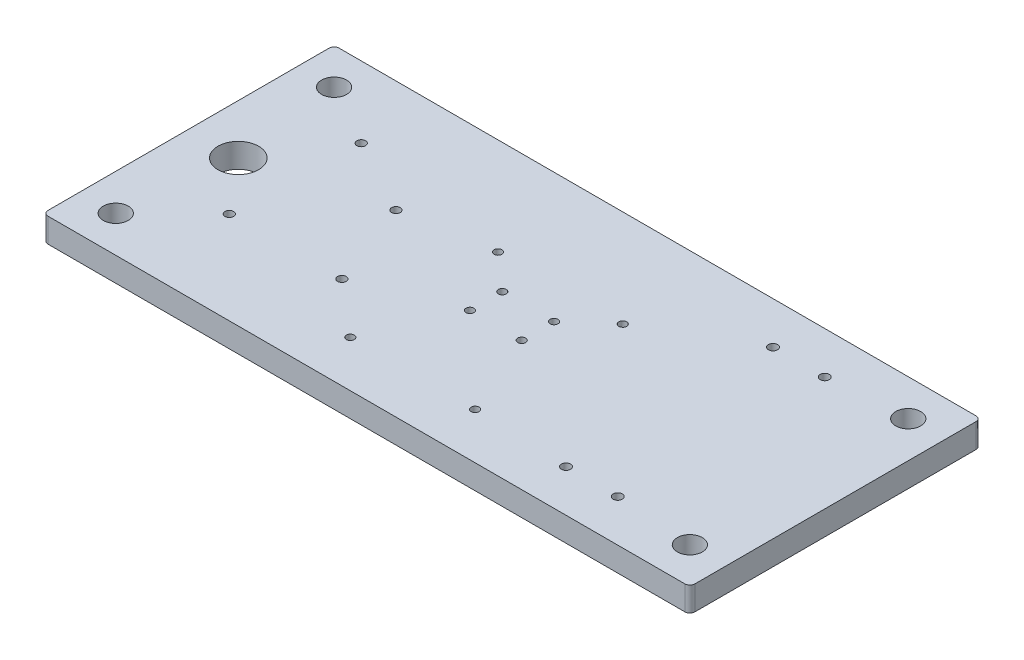
ISO-10303-21;
HEADER;
FILE_DESCRIPTION(('STEP AP214'),'2;1');
FILE_NAME('part.step','',(''),(''),'','','');
FILE_SCHEMA(('AUTOMOTIVE_DESIGN { 1 0 10303 214 1 1 1 1 }'));
ENDSEC;
DATA;
#1=APPLICATION_CONTEXT('core data for automotive mechanical design processes');
#2=APPLICATION_PROTOCOL_DEFINITION('international standard','automotive_design',2000,#1);
#3=PRODUCT_CONTEXT('',#1,'mechanical');
#4=PRODUCT('Part','Part','',(#3));
#5=PRODUCT_RELATED_PRODUCT_CATEGORY('part','',(#4));
#6=PRODUCT_DEFINITION_FORMATION('','',#4);
#7=PRODUCT_DEFINITION_CONTEXT('part definition',#1,'design');
#8=PRODUCT_DEFINITION('design','',#6,#7);
#9=PRODUCT_DEFINITION_SHAPE('','',#8);
#10=(LENGTH_UNIT() NAMED_UNIT(*) SI_UNIT(.MILLI.,.METRE.));
#11=(NAMED_UNIT(*) PLANE_ANGLE_UNIT() SI_UNIT($,.RADIAN.));
#12=(NAMED_UNIT(*) SI_UNIT($,.STERADIAN.) SOLID_ANGLE_UNIT());
#13=UNCERTAINTY_MEASURE_WITH_UNIT(LENGTH_MEASURE(1.E-05),#10,'distance_accuracy_value','');
#14=(GEOMETRIC_REPRESENTATION_CONTEXT(3) GLOBAL_UNCERTAINTY_ASSIGNED_CONTEXT((#13)) GLOBAL_UNIT_ASSIGNED_CONTEXT((#10,
#11,#12)) REPRESENTATION_CONTEXT('',''));
#15=CARTESIAN_POINT('',(0.,0.,0.));
#16=DIRECTION('',(0.,0.,1.));
#17=DIRECTION('',(1.,0.,0.));
#18=AXIS2_PLACEMENT_3D('',#15,#16,#17);
#19=CARTESIAN_POINT('',(127.,9.525,57.15));
#20=DIRECTION('',(-1.,0.,0.));
#21=DIRECTION('',(0.,0.,1.));
#22=AXIS2_PLACEMENT_3D('',#19,#20,#21);
#23=PLANE('',#22);
#24=DIRECTION('',(0.,0.,-1.));
#25=VECTOR('',#24,1.);
#26=CARTESIAN_POINT('',(127.,0.,57.15));
#27=LINE('',#26,#25);
#28=CARTESIAN_POINT('',(127.,0.,55.15));
#29=VERTEX_POINT('',#28);
#30=CARTESIAN_POINT('',(127.,0.,-55.15));
#31=VERTEX_POINT('',#30);
#32=EDGE_CURVE('E148',#29,#31,#27,.T.);
#33=ORIENTED_EDGE('',*,*,#32,.T.);
#34=DIRECTION('',(0.,-1.,0.));
#35=VECTOR('',#34,1.);
#36=CARTESIAN_POINT('',(127.,9.525,-55.15));
#37=LINE('',#36,#35);
#38=CARTESIAN_POINT('',(127.,9.525,-55.15));
#39=VERTEX_POINT('',#38);
#40=EDGE_CURVE('E194',#31,#39,#37,.F.);
#41=ORIENTED_EDGE('',*,*,#40,.T.);
#42=DIRECTION('',(0.,0.,-1.));
#43=VECTOR('',#42,1.);
#44=CARTESIAN_POINT('',(127.,9.525,57.15));
#45=LINE('',#44,#43);
#46=CARTESIAN_POINT('',(127.,9.525,55.15));
#47=VERTEX_POINT('',#46);
#48=EDGE_CURVE('E146',#47,#39,#45,.T.);
#49=ORIENTED_EDGE('',*,*,#48,.F.);
#50=DIRECTION('',(0.,-1.,0.));
#51=VECTOR('',#50,1.);
#52=CARTESIAN_POINT('',(127.,9.525,55.15));
#53=LINE('',#52,#51);
#54=EDGE_CURVE('E190',#47,#29,#53,.T.);
#55=ORIENTED_EDGE('',*,*,#54,.T.);
#56=EDGE_LOOP('',(#33,#41,#49,#55));
#57=FACE_BOUND('',#56,.T.);
#58=ADVANCED_FACE('F45',(#57),#23,.F.);
#59=CARTESIAN_POINT('',(-127.,9.525,-57.15));
#60=DIRECTION('',(0.,0.,1.));
#61=DIRECTION('',(1.,0.,0.));
#62=AXIS2_PLACEMENT_3D('',#59,#60,#61);
#63=PLANE('',#62);
#64=DIRECTION('',(-1.,0.,0.));
#65=VECTOR('',#64,1.);
#66=CARTESIAN_POINT('',(-127.,0.,-57.15));
#67=LINE('',#66,#65);
#68=CARTESIAN_POINT('',(125.,0.,-57.15));
#69=VERTEX_POINT('',#68);
#70=CARTESIAN_POINT('',(-125.,0.,-57.15));
#71=VERTEX_POINT('',#70);
#72=EDGE_CURVE('E142',#69,#71,#67,.T.);
#73=ORIENTED_EDGE('',*,*,#72,.T.);
#74=DIRECTION('',(0.,-1.,0.));
#75=VECTOR('',#74,1.);
#76=CARTESIAN_POINT('',(-125.,9.525,-57.15));
#77=LINE('',#76,#75);
#78=CARTESIAN_POINT('',(-125.,9.525,-57.15));
#79=VERTEX_POINT('',#78);
#80=EDGE_CURVE('E118',#71,#79,#77,.F.);
#81=ORIENTED_EDGE('',*,*,#80,.T.);
#82=DIRECTION('',(-1.,0.,0.));
#83=VECTOR('',#82,1.);
#84=CARTESIAN_POINT('',(-127.,9.525,-57.15));
#85=LINE('',#84,#83);
#86=CARTESIAN_POINT('',(125.,9.525,-57.15));
#87=VERTEX_POINT('',#86);
#88=EDGE_CURVE('E358',#87,#79,#85,.T.);
#89=ORIENTED_EDGE('',*,*,#88,.F.);
#90=DIRECTION('',(0.,-1.,0.));
#91=VECTOR('',#90,1.);
#92=CARTESIAN_POINT('',(125.,9.525,-57.15));
#93=LINE('',#92,#91);
#94=EDGE_CURVE('E124',#87,#69,#93,.T.);
#95=ORIENTED_EDGE('',*,*,#94,.T.);
#96=EDGE_LOOP('',(#73,#81,#89,#95));
#97=FACE_BOUND('',#96,.T.);
#98=ADVANCED_FACE('F379',(#97),#63,.F.);
#99=CARTESIAN_POINT('',(-127.,9.525,57.15));
#100=DIRECTION('',(1.,0.,0.));
#101=DIRECTION('',(0.,0.,-1.));
#102=AXIS2_PLACEMENT_3D('',#99,#100,#101);
#103=PLANE('',#102);
#104=DIRECTION('',(0.,0.,1.));
#105=VECTOR('',#104,1.);
#106=CARTESIAN_POINT('',(-127.,9.525,57.15));
#107=LINE('',#106,#105);
#108=CARTESIAN_POINT('',(-127.,9.525,-55.15));
#109=VERTEX_POINT('',#108);
#110=CARTESIAN_POINT('',(-127.,9.525,55.15));
#111=VERTEX_POINT('',#110);
#112=EDGE_CURVE('E133',#109,#111,#107,.T.);
#113=ORIENTED_EDGE('',*,*,#112,.F.);
#114=DIRECTION('',(0.,-1.,0.));
#115=VECTOR('',#114,1.);
#116=CARTESIAN_POINT('',(-127.,9.525,-55.15));
#117=LINE('',#116,#115);
#118=CARTESIAN_POINT('',(-127.,0.,-55.15));
#119=VERTEX_POINT('',#118);
#120=EDGE_CURVE('E117',#109,#119,#117,.T.);
#121=ORIENTED_EDGE('',*,*,#120,.T.);
#122=DIRECTION('',(0.,0.,1.));
#123=VECTOR('',#122,1.);
#124=CARTESIAN_POINT('',(-127.,0.,57.15));
#125=LINE('',#124,#123);
#126=CARTESIAN_POINT('',(-127.,0.,55.15));
#127=VERTEX_POINT('',#126);
#128=EDGE_CURVE('E131',#119,#127,#125,.T.);
#129=ORIENTED_EDGE('',*,*,#128,.T.);
#130=DIRECTION('',(0.,-1.,0.));
#131=VECTOR('',#130,1.);
#132=CARTESIAN_POINT('',(-127.,9.525,55.15));
#133=LINE('',#132,#131);
#134=EDGE_CURVE('E136',#127,#111,#133,.F.);
#135=ORIENTED_EDGE('',*,*,#134,.T.);
#136=EDGE_LOOP('',(#113,#121,#129,#135));
#137=FACE_BOUND('',#136,.T.);
#138=ADVANCED_FACE('F130',(#137),#103,.F.);
#139=CARTESIAN_POINT('',(-127.,9.525,57.15));
#140=DIRECTION('',(0.,0.,-1.));
#141=DIRECTION('',(-1.,0.,0.));
#142=AXIS2_PLACEMENT_3D('',#139,#140,#141);
#143=PLANE('',#142);
#144=DIRECTION('',(1.,0.,0.));
#145=VECTOR('',#144,1.);
#146=CARTESIAN_POINT('',(-127.,0.,57.15));
#147=LINE('',#146,#145);
#148=CARTESIAN_POINT('',(-125.,0.,57.15));
#149=VERTEX_POINT('',#148);
#150=CARTESIAN_POINT('',(125.,0.,57.15));
#151=VERTEX_POINT('',#150);
#152=EDGE_CURVE('E141',#149,#151,#147,.T.);
#153=ORIENTED_EDGE('',*,*,#152,.T.);
#154=DIRECTION('',(0.,-1.,0.));
#155=VECTOR('',#154,1.);
#156=CARTESIAN_POINT('',(125.,9.525,57.15));
#157=LINE('',#156,#155);
#158=CARTESIAN_POINT('',(125.,9.525,57.15));
#159=VERTEX_POINT('',#158);
#160=EDGE_CURVE('E11',#151,#159,#157,.F.);
#161=ORIENTED_EDGE('',*,*,#160,.T.);
#162=DIRECTION('',(1.,0.,0.));
#163=VECTOR('',#162,1.);
#164=CARTESIAN_POINT('',(-127.,9.525,57.15));
#165=LINE('',#164,#163);
#166=CARTESIAN_POINT('',(-125.,9.525,57.15));
#167=VERTEX_POINT('',#166);
#168=EDGE_CURVE('E165',#167,#159,#165,.T.);
#169=ORIENTED_EDGE('',*,*,#168,.F.);
#170=DIRECTION('',(0.,-1.,0.));
#171=VECTOR('',#170,1.);
#172=CARTESIAN_POINT('',(-125.,9.525,57.15));
#173=LINE('',#172,#171);
#174=EDGE_CURVE('E55',#167,#149,#173,.T.);
#175=ORIENTED_EDGE('',*,*,#174,.T.);
#176=EDGE_LOOP('',(#153,#161,#169,#175));
#177=FACE_BOUND('',#176,.T.);
#178=ADVANCED_FACE('F386',(#177),#143,.F.);
#179=CARTESIAN_POINT('',(0.,9.525,0.));
#180=DIRECTION('',(0.,-1.,0.));
#181=DIRECTION('',(0.,0.,-1.));
#182=AXIS2_PLACEMENT_3D('',#179,#180,#181);
#183=PLANE('',#182);
#184=CARTESIAN_POINT('',(-10.16,9.525,6.35));
#185=DIRECTION('',(0.,1.,0.));
#186=DIRECTION('',(0.,0.,1.));
#187=AXIS2_PLACEMENT_3D('',#184,#185,#186);
#188=CIRCLE('',#187,1.55);
#189=CARTESIAN_POINT('',(-10.16,9.525,7.9));
#190=VERTEX_POINT('',#189);
#191=EDGE_CURVE('E259',#190,#190,#188,.T.);
#192=ORIENTED_EDGE('',*,*,#191,.F.);
#193=EDGE_LOOP('',(#192));
#194=FACE_BOUND('',#193,.T.);
#195=CARTESIAN_POINT('',(10.16,9.525,6.35));
#196=DIRECTION('',(0.,1.,0.));
#197=DIRECTION('',(0.,0.,1.));
#198=AXIS2_PLACEMENT_3D('',#195,#196,#197);
#199=CIRCLE('',#198,1.55);
#200=CARTESIAN_POINT('',(10.16,9.525,7.9));
#201=VERTEX_POINT('',#200);
#202=EDGE_CURVE('E245',#201,#201,#199,.T.);
#203=ORIENTED_EDGE('',*,*,#202,.F.);
#204=EDGE_LOOP('',(#203));
#205=FACE_BOUND('',#204,.T.);
#206=CARTESIAN_POINT('',(10.16,9.525,-6.35));
#207=DIRECTION('',(0.,1.,0.));
#208=DIRECTION('',(0.,0.,1.));
#209=AXIS2_PLACEMENT_3D('',#206,#207,#208);
#210=CIRCLE('',#209,1.55);
#211=CARTESIAN_POINT('',(10.16,9.525,-4.8));
#212=VERTEX_POINT('',#211);
#213=EDGE_CURVE('E244',#212,#212,#210,.T.);
#214=ORIENTED_EDGE('',*,*,#213,.F.);
#215=EDGE_LOOP('',(#214));
#216=FACE_BOUND('',#215,.T.);
#217=CARTESIAN_POINT('',(-10.16,9.525,-6.35));
#218=DIRECTION('',(0.,1.,0.));
#219=DIRECTION('',(0.,0.,1.));
#220=AXIS2_PLACEMENT_3D('',#217,#218,#219);
#221=CIRCLE('',#220,1.55);
#222=CARTESIAN_POINT('',(-10.16,9.525,-4.8));
#223=VERTEX_POINT('',#222);
#224=EDGE_CURVE('E265',#223,#223,#221,.T.);
#225=ORIENTED_EDGE('',*,*,#224,.F.);
#226=EDGE_LOOP('',(#225));
#227=FACE_BOUND('',#226,.T.);
#228=CARTESIAN_POINT('',(61.84,9.525,40.64));
#229=DIRECTION('',(0.,1.,0.));
#230=DIRECTION('',(0.,0.,1.));
#231=AXIS2_PLACEMENT_3D('',#228,#229,#230);
#232=CIRCLE('',#231,1.8);
#233=CARTESIAN_POINT('',(61.84,9.525,42.44));
#234=VERTEX_POINT('',#233);
#235=EDGE_CURVE('E240',#234,#234,#232,.T.);
#236=ORIENTED_EDGE('',*,*,#235,.F.);
#237=EDGE_LOOP('',(#236));
#238=FACE_BOUND('',#237,.T.);
#239=CARTESIAN_POINT('',(82.16,9.525,40.64));
#240=DIRECTION('',(0.,1.,0.));
#241=DIRECTION('',(0.,0.,1.));
#242=AXIS2_PLACEMENT_3D('',#239,#240,#241);
#243=CIRCLE('',#242,1.8);
#244=CARTESIAN_POINT('',(82.16,9.525,42.44));
#245=VERTEX_POINT('',#244);
#246=EDGE_CURVE('E236',#245,#245,#243,.T.);
#247=ORIENTED_EDGE('',*,*,#246,.F.);
#248=EDGE_LOOP('',(#247));
#249=FACE_BOUND('',#248,.T.);
#250=CARTESIAN_POINT('',(82.16,9.525,-40.64));
#251=DIRECTION('',(0.,1.,0.));
#252=DIRECTION('',(0.,0.,1.));
#253=AXIS2_PLACEMENT_3D('',#250,#251,#252);
#254=CIRCLE('',#253,1.8);
#255=CARTESIAN_POINT('',(82.16,9.525,-38.84));
#256=VERTEX_POINT('',#255);
#257=EDGE_CURVE('E231',#256,#256,#254,.T.);
#258=ORIENTED_EDGE('',*,*,#257,.F.);
#259=EDGE_LOOP('',(#258));
#260=FACE_BOUND('',#259,.T.);
#261=CARTESIAN_POINT('',(61.84,9.525,-40.64));
#262=DIRECTION('',(0.,1.,0.));
#263=DIRECTION('',(0.,0.,1.));
#264=AXIS2_PLACEMENT_3D('',#261,#262,#263);
#265=CIRCLE('',#264,1.8);
#266=CARTESIAN_POINT('',(61.84,9.525,-38.84));
#267=VERTEX_POINT('',#266);
#268=EDGE_CURVE('E226',#267,#267,#265,.T.);
#269=ORIENTED_EDGE('',*,*,#268,.F.);
#270=EDGE_LOOP('',(#269));
#271=FACE_BOUND('',#270,.T.);
#272=CARTESIAN_POINT('',(-107.475,9.525,0.));
#273=DIRECTION('',(0.,1.,0.));
#274=DIRECTION('',(0.,0.,1.));
#275=AXIS2_PLACEMENT_3D('',#272,#273,#274);
#276=CIRCLE('',#275,8.);
#277=CARTESIAN_POINT('',(-107.475,9.525,8.));
#278=VERTEX_POINT('',#277);
#279=EDGE_CURVE('E225',#278,#278,#276,.T.);
#280=ORIENTED_EDGE('',*,*,#279,.F.);
#281=EDGE_LOOP('',(#280));
#282=FACE_BOUND('',#281,.T.);
#283=CARTESIAN_POINT('',(-88.35,9.525,-29.15));
#284=DIRECTION('',(0.,1.,0.));
#285=DIRECTION('',(0.,0.,1.));
#286=AXIS2_PLACEMENT_3D('',#283,#284,#285);
#287=CIRCLE('',#286,1.69999999999999);
#288=CARTESIAN_POINT('',(-88.35,9.525,-27.45));
#289=VERTEX_POINT('',#288);
#290=EDGE_CURVE('E220',#289,#289,#287,.T.);
#291=ORIENTED_EDGE('',*,*,#290,.F.);
#292=EDGE_LOOP('',(#291));
#293=FACE_BOUND('',#292,.T.);
#294=CARTESIAN_POINT('',(-58.8,9.525,-13.25));
#295=DIRECTION('',(0.,1.,0.));
#296=DIRECTION('',(0.,0.,1.));
#297=AXIS2_PLACEMENT_3D('',#294,#295,#296);
#298=CIRCLE('',#297,1.7);
#299=CARTESIAN_POINT('',(-58.8,9.525,-11.55));
#300=VERTEX_POINT('',#299);
#301=EDGE_CURVE('E215',#300,#300,#298,.T.);
#302=ORIENTED_EDGE('',*,*,#301,.F.);
#303=EDGE_LOOP('',(#302));
#304=FACE_BOUND('',#303,.T.);
#305=CARTESIAN_POINT('',(-46.,9.525,20.8));
#306=DIRECTION('',(0.,1.,0.));
#307=DIRECTION('',(0.,0.,1.));
#308=AXIS2_PLACEMENT_3D('',#305,#306,#307);
#309=CIRCLE('',#308,1.7);
#310=CARTESIAN_POINT('',(-46.,9.525,22.5));
#311=VERTEX_POINT('',#310);
#312=EDGE_CURVE('E210',#311,#311,#309,.T.);
#313=ORIENTED_EDGE('',*,*,#312,.F.);
#314=EDGE_LOOP('',(#313));
#315=FACE_BOUND('',#314,.T.);
#316=CARTESIAN_POINT('',(-90.2,9.525,20.8));
#317=DIRECTION('',(0.,1.,0.));
#318=DIRECTION('',(0.,0.,1.));
#319=AXIS2_PLACEMENT_3D('',#316,#317,#318);
#320=CIRCLE('',#319,1.69999999999999);
#321=CARTESIAN_POINT('',(-90.2,9.525,22.5));
#322=VERTEX_POINT('',#321);
#323=EDGE_CURVE('E205',#322,#322,#320,.T.);
#324=ORIENTED_EDGE('',*,*,#323,.F.);
#325=EDGE_LOOP('',(#324));
#326=FACE_BOUND('',#325,.T.);
#327=CARTESIAN_POINT('',(-24.5,9.525,39.));
#328=DIRECTION('',(0.,1.,0.));
#329=DIRECTION('',(0.,0.,1.));
#330=AXIS2_PLACEMENT_3D('',#327,#328,#329);
#331=CIRCLE('',#330,1.55);
#332=CARTESIAN_POINT('',(-24.5,9.525,40.55));
#333=VERTEX_POINT('',#332);
#334=EDGE_CURVE('E204',#333,#333,#331,.T.);
#335=ORIENTED_EDGE('',*,*,#334,.F.);
#336=EDGE_LOOP('',(#335));
#337=FACE_BOUND('',#336,.T.);
#338=CARTESIAN_POINT('',(24.5,9.525,39.));
#339=DIRECTION('',(0.,1.,0.));
#340=DIRECTION('',(0.,0.,1.));
#341=AXIS2_PLACEMENT_3D('',#338,#339,#340);
#342=CIRCLE('',#341,1.55);
#343=CARTESIAN_POINT('',(24.5,9.525,40.55));
#344=VERTEX_POINT('',#343);
#345=EDGE_CURVE('E311',#344,#344,#342,.T.);
#346=ORIENTED_EDGE('',*,*,#345,.F.);
#347=EDGE_LOOP('',(#346));
#348=FACE_BOUND('',#347,.T.);
#349=CARTESIAN_POINT('',(-24.5,9.525,-19.));
#350=DIRECTION('',(0.,1.,0.));
#351=DIRECTION('',(0.,0.,1.));
#352=AXIS2_PLACEMENT_3D('',#349,#350,#351);
#353=CIRCLE('',#352,1.55);
#354=CARTESIAN_POINT('',(-24.5,9.525,-17.45));
#355=VERTEX_POINT('',#354);
#356=EDGE_CURVE('E319',#355,#355,#353,.T.);
#357=ORIENTED_EDGE('',*,*,#356,.F.);
#358=EDGE_LOOP('',(#357));
#359=FACE_BOUND('',#358,.T.);
#360=CARTESIAN_POINT('',(24.5,9.525,-19.));
#361=DIRECTION('',(0.,1.,0.));
#362=DIRECTION('',(0.,0.,1.));
#363=AXIS2_PLACEMENT_3D('',#360,#361,#362);
#364=CIRCLE('',#363,1.55);
#365=CARTESIAN_POINT('',(24.5,9.525,-17.45));
#366=VERTEX_POINT('',#365);
#367=EDGE_CURVE('E163',#366,#366,#364,.T.);
#368=ORIENTED_EDGE('',*,*,#367,.F.);
#369=EDGE_LOOP('',(#368));
#370=FACE_BOUND('',#369,.T.);
#371=CARTESIAN_POINT('',(112.7125,9.525,-42.8625000000012));
#372=DIRECTION('',(0.,1.,0.));
#373=DIRECTION('',(0.,0.,1.));
#374=AXIS2_PLACEMENT_3D('',#371,#372,#373);
#375=CIRCLE('',#374,4.9022);
#376=CARTESIAN_POINT('',(112.7125,9.525,-37.9603000000012));
#377=VERTEX_POINT('',#376);
#378=EDGE_CURVE('E162',#377,#377,#375,.T.);
#379=ORIENTED_EDGE('',*,*,#378,.F.);
#380=EDGE_LOOP('',(#379));
#381=FACE_BOUND('',#380,.T.);
#382=CARTESIAN_POINT('',(112.7125,9.525,42.8674999999988));
#383=DIRECTION('',(0.,1.,0.));
#384=DIRECTION('',(0.,0.,1.));
#385=AXIS2_PLACEMENT_3D('',#382,#383,#384);
#386=CIRCLE('',#385,4.9022);
#387=CARTESIAN_POINT('',(112.7125,9.525,47.7696999999988));
#388=VERTEX_POINT('',#387);
#389=EDGE_CURVE('E157',#388,#388,#386,.T.);
#390=ORIENTED_EDGE('',*,*,#389,.F.);
#391=EDGE_LOOP('',(#390));
#392=FACE_BOUND('',#391,.T.);
#393=CARTESIAN_POINT('',(-112.7175,9.525,-42.8625000000012));
#394=DIRECTION('',(0.,1.,0.));
#395=DIRECTION('',(0.,0.,1.));
#396=AXIS2_PLACEMENT_3D('',#393,#394,#395);
#397=CIRCLE('',#396,4.9022);
#398=CARTESIAN_POINT('',(-112.7175,9.525,-37.9603000000012));
#399=VERTEX_POINT('',#398);
#400=EDGE_CURVE('E156',#399,#399,#397,.T.);
#401=ORIENTED_EDGE('',*,*,#400,.F.);
#402=EDGE_LOOP('',(#401));
#403=FACE_BOUND('',#402,.T.);
#404=CARTESIAN_POINT('',(-112.7175,9.525,42.867499999999));
#405=DIRECTION('',(0.,1.,0.));
#406=DIRECTION('',(0.,0.,1.));
#407=AXIS2_PLACEMENT_3D('',#404,#405,#406);
#408=CIRCLE('',#407,4.9022);
#409=CARTESIAN_POINT('',(-112.7175,9.525,47.769699999999));
#410=VERTEX_POINT('',#409);
#411=EDGE_CURVE('E347',#410,#410,#408,.T.);
#412=ORIENTED_EDGE('',*,*,#411,.F.);
#413=EDGE_LOOP('',(#412));
#414=FACE_BOUND('',#413,.T.);
#415=ORIENTED_EDGE('',*,*,#88,.T.);
#416=CARTESIAN_POINT('',(-125.,9.525,-55.15));
#417=DIRECTION('',(0.,-1.,0.));
#418=DIRECTION('',(0.,0.,-1.));
#419=AXIS2_PLACEMENT_3D('',#416,#417,#418);
#420=CIRCLE('',#419,2.);
#421=EDGE_CURVE('E187',#79,#109,#420,.F.);
#422=ORIENTED_EDGE('',*,*,#421,.T.);
#423=ORIENTED_EDGE('',*,*,#112,.T.);
#424=CARTESIAN_POINT('',(-125.,9.525,55.15));
#425=DIRECTION('',(0.,-1.,0.));
#426=DIRECTION('',(0.,0.,-1.));
#427=AXIS2_PLACEMENT_3D('',#424,#425,#426);
#428=CIRCLE('',#427,2.);
#429=EDGE_CURVE('E68',#111,#167,#428,.F.);
#430=ORIENTED_EDGE('',*,*,#429,.T.);
#431=ORIENTED_EDGE('',*,*,#168,.T.);
#432=CARTESIAN_POINT('',(125.,9.525,55.15));
#433=DIRECTION('',(0.,-1.,0.));
#434=DIRECTION('',(0.,0.,-1.));
#435=AXIS2_PLACEMENT_3D('',#432,#433,#434);
#436=CIRCLE('',#435,2.);
#437=EDGE_CURVE('E181',#159,#47,#436,.F.);
#438=ORIENTED_EDGE('',*,*,#437,.T.);
#439=ORIENTED_EDGE('',*,*,#48,.T.);
#440=CARTESIAN_POINT('',(125.,9.525,-55.15));
#441=DIRECTION('',(0.,-1.,0.));
#442=DIRECTION('',(0.,0.,-1.));
#443=AXIS2_PLACEMENT_3D('',#440,#441,#442);
#444=CIRCLE('',#443,2.);
#445=EDGE_CURVE('E184',#39,#87,#444,.F.);
#446=ORIENTED_EDGE('',*,*,#445,.T.);
#447=EDGE_LOOP('',(#415,#422,#423,#430,#431,#438,#439,#446));
#448=FACE_BOUND('',#447,.T.);
#449=ADVANCED_FACE('F377',(#194,#205,#216,#227,#238,#249,#260,#271,#282,#293,#304,#315,#326,
#337,#348,#359,#370,#381,#392,#403,#414,#448),#183,.F.);
#450=CARTESIAN_POINT('',(0.,0.,0.));
#451=DIRECTION('',(0.,-1.,0.));
#452=DIRECTION('',(0.,0.,-1.));
#453=AXIS2_PLACEMENT_3D('',#450,#451,#452);
#454=PLANE('',#453);
#455=CARTESIAN_POINT('',(-10.16,0.,6.35));
#456=DIRECTION('',(0.,-1.,0.));
#457=DIRECTION('',(0.,0.,-1.));
#458=AXIS2_PLACEMENT_3D('',#455,#456,#457);
#459=CIRCLE('',#458,1.55);
#460=CARTESIAN_POINT('',(-10.16,0.,4.8));
#461=VERTEX_POINT('',#460);
#462=EDGE_CURVE('E49',#461,#461,#459,.T.);
#463=ORIENTED_EDGE('',*,*,#462,.F.);
#464=EDGE_LOOP('',(#463));
#465=FACE_BOUND('',#464,.T.);
#466=CARTESIAN_POINT('',(10.16,0.,6.35));
#467=DIRECTION('',(0.,-1.,0.));
#468=DIRECTION('',(0.,0.,-1.));
#469=AXIS2_PLACEMENT_3D('',#466,#467,#468);
#470=CIRCLE('',#469,1.55);
#471=CARTESIAN_POINT('',(10.16,0.,4.8));
#472=VERTEX_POINT('',#471);
#473=EDGE_CURVE('E241',#472,#472,#470,.T.);
#474=ORIENTED_EDGE('',*,*,#473,.F.);
#475=EDGE_LOOP('',(#474));
#476=FACE_BOUND('',#475,.T.);
#477=CARTESIAN_POINT('',(10.16,0.,-6.35));
#478=DIRECTION('',(0.,-1.,0.));
#479=DIRECTION('',(0.,0.,-1.));
#480=AXIS2_PLACEMENT_3D('',#477,#478,#479);
#481=CIRCLE('',#480,1.55);
#482=CARTESIAN_POINT('',(10.16,0.,-7.9));
#483=VERTEX_POINT('',#482);
#484=EDGE_CURVE('E251',#483,#483,#481,.T.);
#485=ORIENTED_EDGE('',*,*,#484,.F.);
#486=EDGE_LOOP('',(#485));
#487=FACE_BOUND('',#486,.T.);
#488=CARTESIAN_POINT('',(-10.16,0.,-6.35));
#489=DIRECTION('',(0.,-1.,0.));
#490=DIRECTION('',(0.,0.,-1.));
#491=AXIS2_PLACEMENT_3D('',#488,#489,#490);
#492=CIRCLE('',#491,1.55);
#493=CARTESIAN_POINT('',(-10.16,0.,-7.9));
#494=VERTEX_POINT('',#493);
#495=EDGE_CURVE('E269',#494,#494,#492,.T.);
#496=ORIENTED_EDGE('',*,*,#495,.F.);
#497=EDGE_LOOP('',(#496));
#498=FACE_BOUND('',#497,.T.);
#499=CARTESIAN_POINT('',(61.84,0.,40.64));
#500=DIRECTION('',(0.,-1.,0.));
#501=DIRECTION('',(0.,0.,-1.));
#502=AXIS2_PLACEMENT_3D('',#499,#500,#501);
#503=CIRCLE('',#502,1.8);
#504=CARTESIAN_POINT('',(61.84,0.,38.84));
#505=VERTEX_POINT('',#504);
#506=EDGE_CURVE('E237',#505,#505,#503,.T.);
#507=ORIENTED_EDGE('',*,*,#506,.F.);
#508=EDGE_LOOP('',(#507));
#509=FACE_BOUND('',#508,.T.);
#510=CARTESIAN_POINT('',(82.16,0.,40.64));
#511=DIRECTION('',(0.,-1.,0.));
#512=DIRECTION('',(0.,0.,-1.));
#513=AXIS2_PLACEMENT_3D('',#510,#511,#512);
#514=CIRCLE('',#513,1.8);
#515=CARTESIAN_POINT('',(82.16,0.,38.84));
#516=VERTEX_POINT('',#515);
#517=EDGE_CURVE('E232',#516,#516,#514,.T.);
#518=ORIENTED_EDGE('',*,*,#517,.F.);
#519=EDGE_LOOP('',(#518));
#520=FACE_BOUND('',#519,.T.);
#521=CARTESIAN_POINT('',(82.16,0.,-40.64));
#522=DIRECTION('',(0.,-1.,0.));
#523=DIRECTION('',(0.,0.,-1.));
#524=AXIS2_PLACEMENT_3D('',#521,#522,#523);
#525=CIRCLE('',#524,1.8);
#526=CARTESIAN_POINT('',(82.16,0.,-42.44));
#527=VERTEX_POINT('',#526);
#528=EDGE_CURVE('E227',#527,#527,#525,.T.);
#529=ORIENTED_EDGE('',*,*,#528,.F.);
#530=EDGE_LOOP('',(#529));
#531=FACE_BOUND('',#530,.T.);
#532=CARTESIAN_POINT('',(61.84,0.,-40.64));
#533=DIRECTION('',(0.,-1.,0.));
#534=DIRECTION('',(0.,0.,-1.));
#535=AXIS2_PLACEMENT_3D('',#532,#533,#534);
#536=CIRCLE('',#535,1.8);
#537=CARTESIAN_POINT('',(61.84,0.,-42.44));
#538=VERTEX_POINT('',#537);
#539=EDGE_CURVE('E221',#538,#538,#536,.T.);
#540=ORIENTED_EDGE('',*,*,#539,.F.);
#541=EDGE_LOOP('',(#540));
#542=FACE_BOUND('',#541,.T.);
#543=CARTESIAN_POINT('',(-107.475,0.,0.));
#544=DIRECTION('',(0.,1.,0.));
#545=DIRECTION('',(0.,0.,1.));
#546=AXIS2_PLACEMENT_3D('',#543,#544,#545);
#547=CIRCLE('',#546,8.);
#548=CARTESIAN_POINT('',(-107.475,0.,8.));
#549=VERTEX_POINT('',#548);
#550=EDGE_CURVE('E285',#549,#549,#547,.T.);
#551=ORIENTED_EDGE('',*,*,#550,.T.);
#552=EDGE_LOOP('',(#551));
#553=FACE_BOUND('',#552,.T.);
#554=CARTESIAN_POINT('',(-88.35,0.,-29.15));
#555=DIRECTION('',(0.,-1.,0.));
#556=DIRECTION('',(0.,0.,-1.));
#557=AXIS2_PLACEMENT_3D('',#554,#555,#556);
#558=CIRCLE('',#557,1.69999999999999);
#559=CARTESIAN_POINT('',(-88.35,0.,-30.85));
#560=VERTEX_POINT('',#559);
#561=EDGE_CURVE('E216',#560,#560,#558,.T.);
#562=ORIENTED_EDGE('',*,*,#561,.F.);
#563=EDGE_LOOP('',(#562));
#564=FACE_BOUND('',#563,.T.);
#565=CARTESIAN_POINT('',(-58.8,0.,-13.25));
#566=DIRECTION('',(0.,-1.,0.));
#567=DIRECTION('',(0.,0.,-1.));
#568=AXIS2_PLACEMENT_3D('',#565,#566,#567);
#569=CIRCLE('',#568,1.7);
#570=CARTESIAN_POINT('',(-58.8,0.,-14.95));
#571=VERTEX_POINT('',#570);
#572=EDGE_CURVE('E211',#571,#571,#569,.T.);
#573=ORIENTED_EDGE('',*,*,#572,.F.);
#574=EDGE_LOOP('',(#573));
#575=FACE_BOUND('',#574,.T.);
#576=CARTESIAN_POINT('',(-46.,0.,20.8));
#577=DIRECTION('',(0.,-1.,0.));
#578=DIRECTION('',(0.,0.,-1.));
#579=AXIS2_PLACEMENT_3D('',#576,#577,#578);
#580=CIRCLE('',#579,1.7);
#581=CARTESIAN_POINT('',(-46.,0.,19.1));
#582=VERTEX_POINT('',#581);
#583=EDGE_CURVE('E206',#582,#582,#580,.T.);
#584=ORIENTED_EDGE('',*,*,#583,.F.);
#585=EDGE_LOOP('',(#584));
#586=FACE_BOUND('',#585,.T.);
#587=CARTESIAN_POINT('',(-90.2,0.,20.8));
#588=DIRECTION('',(0.,-1.,0.));
#589=DIRECTION('',(0.,0.,-1.));
#590=AXIS2_PLACEMENT_3D('',#587,#588,#589);
#591=CIRCLE('',#590,1.69999999999999);
#592=CARTESIAN_POINT('',(-90.2,0.,19.1));
#593=VERTEX_POINT('',#592);
#594=EDGE_CURVE('E200',#593,#593,#591,.T.);
#595=ORIENTED_EDGE('',*,*,#594,.F.);
#596=EDGE_LOOP('',(#595));
#597=FACE_BOUND('',#596,.T.);
#598=CARTESIAN_POINT('',(-24.5,0.,39.));
#599=DIRECTION('',(0.,-1.,0.));
#600=DIRECTION('',(0.,0.,-1.));
#601=AXIS2_PLACEMENT_3D('',#598,#599,#600);
#602=CIRCLE('',#601,1.55);
#603=CARTESIAN_POINT('',(-24.5,0.,37.45));
#604=VERTEX_POINT('',#603);
#605=EDGE_CURVE('E307',#604,#604,#602,.T.);
#606=ORIENTED_EDGE('',*,*,#605,.F.);
#607=EDGE_LOOP('',(#606));
#608=FACE_BOUND('',#607,.T.);
#609=CARTESIAN_POINT('',(24.5,0.,39.));
#610=DIRECTION('',(0.,-1.,0.));
#611=DIRECTION('',(0.,0.,-1.));
#612=AXIS2_PLACEMENT_3D('',#609,#610,#611);
#613=CIRCLE('',#612,1.55);
#614=CARTESIAN_POINT('',(24.5,0.,37.45));
#615=VERTEX_POINT('',#614);
#616=EDGE_CURVE('E315',#615,#615,#613,.T.);
#617=ORIENTED_EDGE('',*,*,#616,.F.);
#618=EDGE_LOOP('',(#617));
#619=FACE_BOUND('',#618,.T.);
#620=CARTESIAN_POINT('',(-24.5,0.,-19.));
#621=DIRECTION('',(0.,-1.,0.));
#622=DIRECTION('',(0.,0.,-1.));
#623=AXIS2_PLACEMENT_3D('',#620,#621,#622);
#624=CIRCLE('',#623,1.55);
#625=CARTESIAN_POINT('',(-24.5,0.,-20.55));
#626=VERTEX_POINT('',#625);
#627=EDGE_CURVE('E323',#626,#626,#624,.T.);
#628=ORIENTED_EDGE('',*,*,#627,.F.);
#629=EDGE_LOOP('',(#628));
#630=FACE_BOUND('',#629,.T.);
#631=CARTESIAN_POINT('',(24.5,0.,-19.));
#632=DIRECTION('',(0.,-1.,0.));
#633=DIRECTION('',(0.,0.,-1.));
#634=AXIS2_PLACEMENT_3D('',#631,#632,#633);
#635=CIRCLE('',#634,1.55);
#636=CARTESIAN_POINT('',(24.5,0.,-20.55));
#637=VERTEX_POINT('',#636);
#638=EDGE_CURVE('E158',#637,#637,#635,.T.);
#639=ORIENTED_EDGE('',*,*,#638,.F.);
#640=EDGE_LOOP('',(#639));
#641=FACE_BOUND('',#640,.T.);
#642=CARTESIAN_POINT('',(112.7125,0.,-42.8625000000012));
#643=DIRECTION('',(0.,-1.,0.));
#644=DIRECTION('',(0.,0.,-1.));
#645=AXIS2_PLACEMENT_3D('',#642,#643,#644);
#646=CIRCLE('',#645,4.9022);
#647=CARTESIAN_POINT('',(112.7125,0.,-47.7647000000012));
#648=VERTEX_POINT('',#647);
#649=EDGE_CURVE('E333',#648,#648,#646,.T.);
#650=ORIENTED_EDGE('',*,*,#649,.F.);
#651=EDGE_LOOP('',(#650));
#652=FACE_BOUND('',#651,.T.);
#653=CARTESIAN_POINT('',(112.7125,0.,42.8674999999988));
#654=DIRECTION('',(0.,-1.,0.));
#655=DIRECTION('',(0.,0.,-1.));
#656=AXIS2_PLACEMENT_3D('',#653,#654,#655);
#657=CIRCLE('',#656,4.9022);
#658=CARTESIAN_POINT('',(112.7125,0.,37.9652999999988));
#659=VERTEX_POINT('',#658);
#660=EDGE_CURVE('E152',#659,#659,#657,.T.);
#661=ORIENTED_EDGE('',*,*,#660,.F.);
#662=EDGE_LOOP('',(#661));
#663=FACE_BOUND('',#662,.T.);
#664=CARTESIAN_POINT('',(-112.7175,0.,-42.8625000000012));
#665=DIRECTION('',(0.,-1.,0.));
#666=DIRECTION('',(0.,0.,-1.));
#667=AXIS2_PLACEMENT_3D('',#664,#665,#666);
#668=CIRCLE('',#667,4.9022);
#669=CARTESIAN_POINT('',(-112.7175,0.,-47.7647000000012));
#670=VERTEX_POINT('',#669);
#671=EDGE_CURVE('E343',#670,#670,#668,.T.);
#672=ORIENTED_EDGE('',*,*,#671,.F.);
#673=EDGE_LOOP('',(#672));
#674=FACE_BOUND('',#673,.T.);
#675=CARTESIAN_POINT('',(-112.7175,0.,42.867499999999));
#676=DIRECTION('',(0.,-1.,0.));
#677=DIRECTION('',(0.,0.,-1.));
#678=AXIS2_PLACEMENT_3D('',#675,#676,#677);
#679=CIRCLE('',#678,4.9022);
#680=CARTESIAN_POINT('',(-112.7175,0.,37.965299999999));
#681=VERTEX_POINT('',#680);
#682=EDGE_CURVE('E351',#681,#681,#679,.T.);
#683=ORIENTED_EDGE('',*,*,#682,.F.);
#684=EDGE_LOOP('',(#683));
#685=FACE_BOUND('',#684,.T.);
#686=ORIENTED_EDGE('',*,*,#128,.F.);
#687=CARTESIAN_POINT('',(-125.,0.,-55.15));
#688=DIRECTION('',(0.,-1.,0.));
#689=DIRECTION('',(0.,0.,-1.));
#690=AXIS2_PLACEMENT_3D('',#687,#688,#689);
#691=CIRCLE('',#690,2.);
#692=EDGE_CURVE('E113',#119,#71,#691,.T.);
#693=ORIENTED_EDGE('',*,*,#692,.T.);
#694=ORIENTED_EDGE('',*,*,#72,.F.);
#695=CARTESIAN_POINT('',(125.,0.,-55.15));
#696=DIRECTION('',(0.,-1.,0.));
#697=DIRECTION('',(0.,0.,-1.));
#698=AXIS2_PLACEMENT_3D('',#695,#696,#697);
#699=CIRCLE('',#698,2.);
#700=EDGE_CURVE('E125',#69,#31,#699,.T.);
#701=ORIENTED_EDGE('',*,*,#700,.T.);
#702=ORIENTED_EDGE('',*,*,#32,.F.);
#703=CARTESIAN_POINT('',(125.,0.,55.15));
#704=DIRECTION('',(0.,-1.,0.));
#705=DIRECTION('',(0.,0.,-1.));
#706=AXIS2_PLACEMENT_3D('',#703,#704,#705);
#707=CIRCLE('',#706,2.);
#708=EDGE_CURVE('E169',#29,#151,#707,.T.);
#709=ORIENTED_EDGE('',*,*,#708,.T.);
#710=ORIENTED_EDGE('',*,*,#152,.F.);
#711=CARTESIAN_POINT('',(-125.,0.,55.15));
#712=DIRECTION('',(0.,-1.,0.));
#713=DIRECTION('',(0.,0.,-1.));
#714=AXIS2_PLACEMENT_3D('',#711,#712,#713);
#715=CIRCLE('',#714,2.);
#716=EDGE_CURVE('E135',#149,#127,#715,.T.);
#717=ORIENTED_EDGE('',*,*,#716,.T.);
#718=EDGE_LOOP('',(#686,#693,#694,#701,#702,#709,#710,#717));
#719=FACE_BOUND('',#718,.T.);
#720=ADVANCED_FACE('F138',(#465,#476,#487,#498,#509,#520,#531,#542,#553,#564,#575,#586,#597,
#608,#619,#630,#641,#652,#663,#674,#685,#719),#454,.T.);
#721=CARTESIAN_POINT('',(-112.7175,9.525,42.867499999999));
#722=DIRECTION('',(0.,1.,0.));
#723=DIRECTION('',(0.,0.,1.));
#724=AXIS2_PLACEMENT_3D('',#721,#722,#723);
#725=CYLINDRICAL_SURFACE('',#724,4.9022);
#726=ORIENTED_EDGE('',*,*,#682,.T.);
#727=EDGE_LOOP('',(#726));
#728=FACE_BOUND('',#727,.T.);
#729=ORIENTED_EDGE('',*,*,#411,.T.);
#730=EDGE_LOOP('',(#729));
#731=FACE_BOUND('',#730,.T.);
#732=ADVANCED_FACE('F413',(#728,#731),#725,.F.);
#733=CARTESIAN_POINT('',(-112.7175,9.525,-42.8625000000012));
#734=DIRECTION('',(0.,1.,0.));
#735=DIRECTION('',(0.,0.,1.));
#736=AXIS2_PLACEMENT_3D('',#733,#734,#735);
#737=CYLINDRICAL_SURFACE('',#736,4.9022);
#738=ORIENTED_EDGE('',*,*,#671,.T.);
#739=EDGE_LOOP('',(#738));
#740=FACE_BOUND('',#739,.T.);
#741=ORIENTED_EDGE('',*,*,#400,.T.);
#742=EDGE_LOOP('',(#741));
#743=FACE_BOUND('',#742,.T.);
#744=ADVANCED_FACE('F418',(#740,#743),#737,.F.);
#745=CARTESIAN_POINT('',(112.7125,9.525,42.8674999999988));
#746=DIRECTION('',(0.,1.,0.));
#747=DIRECTION('',(0.,0.,1.));
#748=AXIS2_PLACEMENT_3D('',#745,#746,#747);
#749=CYLINDRICAL_SURFACE('',#748,4.9022);
#750=ORIENTED_EDGE('',*,*,#660,.T.);
#751=EDGE_LOOP('',(#750));
#752=FACE_BOUND('',#751,.T.);
#753=ORIENTED_EDGE('',*,*,#389,.T.);
#754=EDGE_LOOP('',(#753));
#755=FACE_BOUND('',#754,.T.);
#756=ADVANCED_FACE('F422',(#752,#755),#749,.F.);
#757=CARTESIAN_POINT('',(112.7125,9.525,-42.8625000000012));
#758=DIRECTION('',(0.,1.,0.));
#759=DIRECTION('',(0.,0.,1.));
#760=AXIS2_PLACEMENT_3D('',#757,#758,#759);
#761=CYLINDRICAL_SURFACE('',#760,4.9022);
#762=ORIENTED_EDGE('',*,*,#649,.T.);
#763=EDGE_LOOP('',(#762));
#764=FACE_BOUND('',#763,.T.);
#765=ORIENTED_EDGE('',*,*,#378,.T.);
#766=EDGE_LOOP('',(#765));
#767=FACE_BOUND('',#766,.T.);
#768=ADVANCED_FACE('F426',(#764,#767),#761,.F.);
#769=CARTESIAN_POINT('',(24.5,9.525,-19.));
#770=DIRECTION('',(0.,1.,0.));
#771=DIRECTION('',(0.,0.,1.));
#772=AXIS2_PLACEMENT_3D('',#769,#770,#771);
#773=CYLINDRICAL_SURFACE('',#772,1.55);
#774=ORIENTED_EDGE('',*,*,#638,.T.);
#775=EDGE_LOOP('',(#774));
#776=FACE_BOUND('',#775,.T.);
#777=ORIENTED_EDGE('',*,*,#367,.T.);
#778=EDGE_LOOP('',(#777));
#779=FACE_BOUND('',#778,.T.);
#780=ADVANCED_FACE('F430',(#776,#779),#773,.F.);
#781=CARTESIAN_POINT('',(-24.5,9.525,-19.));
#782=DIRECTION('',(0.,1.,0.));
#783=DIRECTION('',(0.,0.,1.));
#784=AXIS2_PLACEMENT_3D('',#781,#782,#783);
#785=CYLINDRICAL_SURFACE('',#784,1.55);
#786=ORIENTED_EDGE('',*,*,#627,.T.);
#787=EDGE_LOOP('',(#786));
#788=FACE_BOUND('',#787,.T.);
#789=ORIENTED_EDGE('',*,*,#356,.T.);
#790=EDGE_LOOP('',(#789));
#791=FACE_BOUND('',#790,.T.);
#792=ADVANCED_FACE('F434',(#788,#791),#785,.F.);
#793=CARTESIAN_POINT('',(24.5,9.525,39.));
#794=DIRECTION('',(0.,1.,0.));
#795=DIRECTION('',(0.,0.,1.));
#796=AXIS2_PLACEMENT_3D('',#793,#794,#795);
#797=CYLINDRICAL_SURFACE('',#796,1.55);
#798=ORIENTED_EDGE('',*,*,#616,.T.);
#799=EDGE_LOOP('',(#798));
#800=FACE_BOUND('',#799,.T.);
#801=ORIENTED_EDGE('',*,*,#345,.T.);
#802=EDGE_LOOP('',(#801));
#803=FACE_BOUND('',#802,.T.);
#804=ADVANCED_FACE('F438',(#800,#803),#797,.F.);
#805=CARTESIAN_POINT('',(-24.5,9.525,39.));
#806=DIRECTION('',(0.,1.,0.));
#807=DIRECTION('',(0.,0.,1.));
#808=AXIS2_PLACEMENT_3D('',#805,#806,#807);
#809=CYLINDRICAL_SURFACE('',#808,1.55);
#810=ORIENTED_EDGE('',*,*,#605,.T.);
#811=EDGE_LOOP('',(#810));
#812=FACE_BOUND('',#811,.T.);
#813=ORIENTED_EDGE('',*,*,#334,.T.);
#814=EDGE_LOOP('',(#813));
#815=FACE_BOUND('',#814,.T.);
#816=ADVANCED_FACE('F393',(#812,#815),#809,.F.);
#817=CARTESIAN_POINT('',(-125.,9.525,-55.15));
#818=DIRECTION('',(0.,-1.,0.));
#819=DIRECTION('',(0.,0.,-1.));
#820=AXIS2_PLACEMENT_3D('',#817,#818,#819);
#821=CYLINDRICAL_SURFACE('',#820,2.);
#822=ORIENTED_EDGE('',*,*,#421,.F.);
#823=ORIENTED_EDGE('',*,*,#80,.F.);
#824=ORIENTED_EDGE('',*,*,#692,.F.);
#825=ORIENTED_EDGE('',*,*,#120,.F.);
#826=EDGE_LOOP('',(#822,#823,#824,#825));
#827=FACE_BOUND('',#826,.T.);
#828=ADVANCED_FACE('F116',(#827),#821,.T.);
#829=CARTESIAN_POINT('',(125.,9.525,-55.15));
#830=DIRECTION('',(0.,-1.,0.));
#831=DIRECTION('',(0.,0.,-1.));
#832=AXIS2_PLACEMENT_3D('',#829,#830,#831);
#833=CYLINDRICAL_SURFACE('',#832,2.);
#834=ORIENTED_EDGE('',*,*,#445,.F.);
#835=ORIENTED_EDGE('',*,*,#40,.F.);
#836=ORIENTED_EDGE('',*,*,#700,.F.);
#837=ORIENTED_EDGE('',*,*,#94,.F.);
#838=EDGE_LOOP('',(#834,#835,#836,#837));
#839=FACE_BOUND('',#838,.T.);
#840=ADVANCED_FACE('F374',(#839),#833,.T.);
#841=CARTESIAN_POINT('',(125.,9.525,55.15));
#842=DIRECTION('',(0.,-1.,0.));
#843=DIRECTION('',(0.,0.,-1.));
#844=AXIS2_PLACEMENT_3D('',#841,#842,#843);
#845=CYLINDRICAL_SURFACE('',#844,2.);
#846=ORIENTED_EDGE('',*,*,#437,.F.);
#847=ORIENTED_EDGE('',*,*,#160,.F.);
#848=ORIENTED_EDGE('',*,*,#708,.F.);
#849=ORIENTED_EDGE('',*,*,#54,.F.);
#850=EDGE_LOOP('',(#846,#847,#848,#849));
#851=FACE_BOUND('',#850,.T.);
#852=ADVANCED_FACE('F395',(#851),#845,.T.);
#853=CARTESIAN_POINT('',(-125.,9.525,55.15));
#854=DIRECTION('',(0.,-1.,0.));
#855=DIRECTION('',(0.,0.,-1.));
#856=AXIS2_PLACEMENT_3D('',#853,#854,#855);
#857=CYLINDRICAL_SURFACE('',#856,2.);
#858=ORIENTED_EDGE('',*,*,#429,.F.);
#859=ORIENTED_EDGE('',*,*,#134,.F.);
#860=ORIENTED_EDGE('',*,*,#716,.F.);
#861=ORIENTED_EDGE('',*,*,#174,.F.);
#862=EDGE_LOOP('',(#858,#859,#860,#861));
#863=FACE_BOUND('',#862,.T.);
#864=ADVANCED_FACE('F47',(#863),#857,.T.);
#865=CARTESIAN_POINT('',(-90.2,9.525,20.8));
#866=DIRECTION('',(0.,1.,0.));
#867=DIRECTION('',(0.,0.,1.));
#868=AXIS2_PLACEMENT_3D('',#865,#866,#867);
#869=CYLINDRICAL_SURFACE('',#868,1.69999999999999);
#870=ORIENTED_EDGE('',*,*,#594,.T.);
#871=EDGE_LOOP('',(#870));
#872=FACE_BOUND('',#871,.T.);
#873=ORIENTED_EDGE('',*,*,#323,.T.);
#874=EDGE_LOOP('',(#873));
#875=FACE_BOUND('',#874,.T.);
#876=ADVANCED_FACE('F401',(#872,#875),#869,.F.);
#877=CARTESIAN_POINT('',(-46.,9.525,20.8));
#878=DIRECTION('',(0.,1.,0.));
#879=DIRECTION('',(0.,0.,1.));
#880=AXIS2_PLACEMENT_3D('',#877,#878,#879);
#881=CYLINDRICAL_SURFACE('',#880,1.7);
#882=ORIENTED_EDGE('',*,*,#583,.T.);
#883=EDGE_LOOP('',(#882));
#884=FACE_BOUND('',#883,.T.);
#885=ORIENTED_EDGE('',*,*,#312,.T.);
#886=EDGE_LOOP('',(#885));
#887=FACE_BOUND('',#886,.T.);
#888=ADVANCED_FACE('F448',(#884,#887),#881,.F.);
#889=CARTESIAN_POINT('',(-58.8,9.525,-13.25));
#890=DIRECTION('',(0.,1.,0.));
#891=DIRECTION('',(0.,0.,1.));
#892=AXIS2_PLACEMENT_3D('',#889,#890,#891);
#893=CYLINDRICAL_SURFACE('',#892,1.7);
#894=ORIENTED_EDGE('',*,*,#572,.T.);
#895=EDGE_LOOP('',(#894));
#896=FACE_BOUND('',#895,.T.);
#897=ORIENTED_EDGE('',*,*,#301,.T.);
#898=EDGE_LOOP('',(#897));
#899=FACE_BOUND('',#898,.T.);
#900=ADVANCED_FACE('F452',(#896,#899),#893,.F.);
#901=CARTESIAN_POINT('',(-88.35,9.525,-29.15));
#902=DIRECTION('',(0.,1.,0.));
#903=DIRECTION('',(0.,0.,1.));
#904=AXIS2_PLACEMENT_3D('',#901,#902,#903);
#905=CYLINDRICAL_SURFACE('',#904,1.69999999999999);
#906=ORIENTED_EDGE('',*,*,#561,.T.);
#907=EDGE_LOOP('',(#906));
#908=FACE_BOUND('',#907,.T.);
#909=ORIENTED_EDGE('',*,*,#290,.T.);
#910=EDGE_LOOP('',(#909));
#911=FACE_BOUND('',#910,.T.);
#912=ADVANCED_FACE('F456',(#908,#911),#905,.F.);
#913=CARTESIAN_POINT('',(-107.475,0.,0.));
#914=DIRECTION('',(0.,1.,0.));
#915=DIRECTION('',(0.,0.,1.));
#916=AXIS2_PLACEMENT_3D('',#913,#914,#915);
#917=CYLINDRICAL_SURFACE('',#916,8.);
#918=CARTESIAN_POINT('',(-107.475,0.,8.));
#919=CARTESIAN_POINT('',(-107.475,0.0992187499999999,8.));
#920=CARTESIAN_POINT('',(-107.475,0.1984375,8.));
#921=CARTESIAN_POINT('',(-107.475,0.396875,8.));
#922=CARTESIAN_POINT('',(-107.475,0.49609375,8.));
#923=CARTESIAN_POINT('',(-107.475,0.69453125,8.));
#924=CARTESIAN_POINT('',(-107.475,0.79375,8.));
#925=CARTESIAN_POINT('',(-107.475,0.9921875,8.));
#926=CARTESIAN_POINT('',(-107.475,1.09140625,8.));
#927=CARTESIAN_POINT('',(-107.475,1.28984375,8.));
#928=CARTESIAN_POINT('',(-107.475,1.3890625,8.));
#929=CARTESIAN_POINT('',(-107.475,1.5875,8.));
#930=CARTESIAN_POINT('',(-107.475,1.68671875,8.));
#931=CARTESIAN_POINT('',(-107.475,1.88515625,8.));
#932=CARTESIAN_POINT('',(-107.475,1.984375,8.));
#933=CARTESIAN_POINT('',(-107.475,2.1828125,8.));
#934=CARTESIAN_POINT('',(-107.475,2.28203125,8.));
#935=CARTESIAN_POINT('',(-107.475,2.48046875,8.));
#936=CARTESIAN_POINT('',(-107.475,2.5796875,8.));
#937=CARTESIAN_POINT('',(-107.475,2.778125,8.));
#938=CARTESIAN_POINT('',(-107.475,2.87734375,8.));
#939=CARTESIAN_POINT('',(-107.475,3.07578125,8.));
#940=CARTESIAN_POINT('',(-107.475,3.175,8.));
#941=CARTESIAN_POINT('',(-107.475,3.3734375,8.));
#942=CARTESIAN_POINT('',(-107.475,3.47265625,8.));
#943=CARTESIAN_POINT('',(-107.475,3.67109375,8.));
#944=CARTESIAN_POINT('',(-107.475,3.7703125,8.));
#945=CARTESIAN_POINT('',(-107.475,3.96875,8.));
#946=CARTESIAN_POINT('',(-107.475,4.06796875,8.));
#947=CARTESIAN_POINT('',(-107.475,4.26640625,8.));
#948=CARTESIAN_POINT('',(-107.475,4.365625,8.));
#949=CARTESIAN_POINT('',(-107.475,4.5640625,8.));
#950=CARTESIAN_POINT('',(-107.475,4.66328125,8.));
#951=CARTESIAN_POINT('',(-107.475,4.86171875,8.));
#952=CARTESIAN_POINT('',(-107.475,4.9609375,8.));
#953=CARTESIAN_POINT('',(-107.475,5.159375,8.));
#954=CARTESIAN_POINT('',(-107.475,5.25859375,8.));
#955=CARTESIAN_POINT('',(-107.475,5.45703125,8.));
#956=CARTESIAN_POINT('',(-107.475,5.55625,8.));
#957=CARTESIAN_POINT('',(-107.475,5.7546875,8.));
#958=CARTESIAN_POINT('',(-107.475,5.85390625,8.));
#959=CARTESIAN_POINT('',(-107.475,6.05234375,8.));
#960=CARTESIAN_POINT('',(-107.475,6.1515625,8.));
#961=CARTESIAN_POINT('',(-107.475,6.35,8.));
#962=CARTESIAN_POINT('',(-107.475,6.44921875,8.));
#963=CARTESIAN_POINT('',(-107.475,6.64765625,8.));
#964=CARTESIAN_POINT('',(-107.475,6.746875,8.));
#965=CARTESIAN_POINT('',(-107.475,6.9453125,8.));
#966=CARTESIAN_POINT('',(-107.475,7.04453125,8.));
#967=CARTESIAN_POINT('',(-107.475,7.24296875,8.));
#968=CARTESIAN_POINT('',(-107.475,7.3421875,8.));
#969=CARTESIAN_POINT('',(-107.475,7.540625,8.));
#970=CARTESIAN_POINT('',(-107.475,7.63984375,8.));
#971=CARTESIAN_POINT('',(-107.475,7.83828125,8.));
#972=CARTESIAN_POINT('',(-107.475,7.9375,8.));
#973=CARTESIAN_POINT('',(-107.475,8.1359375,8.));
#974=CARTESIAN_POINT('',(-107.475,8.23515625,8.));
#975=CARTESIAN_POINT('',(-107.475,8.43359375,8.));
#976=CARTESIAN_POINT('',(-107.475,8.5328125,8.));
#977=CARTESIAN_POINT('',(-107.475,8.73125,8.));
#978=CARTESIAN_POINT('',(-107.475,8.83046875,8.));
#979=CARTESIAN_POINT('',(-107.475,9.02890625,8.));
#980=CARTESIAN_POINT('',(-107.475,9.128125,8.));
#981=CARTESIAN_POINT('',(-107.475,9.3265625,8.));
#982=CARTESIAN_POINT('',(-107.475,9.42578125,8.));
#983=CARTESIAN_POINT('',(-107.475,9.525,8.));
#984=B_SPLINE_CURVE_WITH_KNOTS('',3,(#918,#919,#920,#921,#922,#923,#924,#925,#926,#927,#928,
#929,#930,#931,#932,#933,#934,#935,#936,#937,#938,#939,#940,#941,#942,#943,#944,#945,#946,#947,
#948,#949,#950,#951,#952,#953,#954,#955,#956,#957,#958,#959,#960,#961,#962,#963,#964,#965,#966,
#967,#968,#969,#970,#971,#972,#973,#974,#975,#976,#977,#978,#979,#980,#981,#982,#983),
.UNSPECIFIED.,.F.,.F.,(4,2,2,2,2,2,2,2,2,2,2,2,2,2,2,2,2,2,2,2,2,2,2,2,2,2,2,2,2,2,2,2,4),(0.,
0.29765625,0.5953125,0.89296875,1.190625,1.48828125,1.7859375,2.08359375,2.38125,2.67890625,
2.9765625,3.27421875,3.571875,3.86953125,4.1671875,4.46484375,4.7625,5.06015625,5.3578125,
5.65546875,5.953125,6.25078125,6.5484375,6.84609375,7.14375,7.44140625,7.7390625,8.03671875,
8.334375,8.63203125,8.9296875,9.22734375,9.525),.UNSPECIFIED.);
#985=EDGE_CURVE('BSEAM460',#549,#278,#984,.T.);
#986=ORIENTED_EDGE('',*,*,#550,.F.);
#987=ORIENTED_EDGE('',*,*,#279,.T.);
#988=ORIENTED_EDGE('',*,*,#985,.T.);
#989=ORIENTED_EDGE('',*,*,#985,.F.);
#990=EDGE_LOOP('',(#986,#988,#987,#989));
#991=FACE_BOUND('',#990,.T.);
#992=ADVANCED_FACE('F460',(#991),#917,.F.);
#993=CARTESIAN_POINT('',(61.84,9.525,-40.64));
#994=DIRECTION('',(0.,1.,0.));
#995=DIRECTION('',(0.,0.,1.));
#996=AXIS2_PLACEMENT_3D('',#993,#994,#995);
#997=CYLINDRICAL_SURFACE('',#996,1.8);
#998=ORIENTED_EDGE('',*,*,#539,.T.);
#999=EDGE_LOOP('',(#998));
#1000=FACE_BOUND('',#999,.T.);
#1001=ORIENTED_EDGE('',*,*,#268,.T.);
#1002=EDGE_LOOP('',(#1001));
#1003=FACE_BOUND('',#1002,.T.);
#1004=ADVANCED_FACE('F464',(#1000,#1003),#997,.F.);
#1005=CARTESIAN_POINT('',(82.16,9.525,-40.64));
#1006=DIRECTION('',(0.,1.,0.));
#1007=DIRECTION('',(0.,0.,1.));
#1008=AXIS2_PLACEMENT_3D('',#1005,#1006,#1007);
#1009=CYLINDRICAL_SURFACE('',#1008,1.8);
#1010=ORIENTED_EDGE('',*,*,#528,.T.);
#1011=EDGE_LOOP('',(#1010));
#1012=FACE_BOUND('',#1011,.T.);
#1013=ORIENTED_EDGE('',*,*,#257,.T.);
#1014=EDGE_LOOP('',(#1013));
#1015=FACE_BOUND('',#1014,.T.);
#1016=ADVANCED_FACE('F468',(#1012,#1015),#1009,.F.);
#1017=CARTESIAN_POINT('',(82.16,9.525,40.64));
#1018=DIRECTION('',(0.,1.,0.));
#1019=DIRECTION('',(0.,0.,1.));
#1020=AXIS2_PLACEMENT_3D('',#1017,#1018,#1019);
#1021=CYLINDRICAL_SURFACE('',#1020,1.8);
#1022=ORIENTED_EDGE('',*,*,#517,.T.);
#1023=EDGE_LOOP('',(#1022));
#1024=FACE_BOUND('',#1023,.T.);
#1025=ORIENTED_EDGE('',*,*,#246,.T.);
#1026=EDGE_LOOP('',(#1025));
#1027=FACE_BOUND('',#1026,.T.);
#1028=ADVANCED_FACE('F472',(#1024,#1027),#1021,.F.);
#1029=CARTESIAN_POINT('',(61.84,9.525,40.64));
#1030=DIRECTION('',(0.,1.,0.));
#1031=DIRECTION('',(0.,0.,1.));
#1032=AXIS2_PLACEMENT_3D('',#1029,#1030,#1031);
#1033=CYLINDRICAL_SURFACE('',#1032,1.8);
#1034=ORIENTED_EDGE('',*,*,#506,.T.);
#1035=EDGE_LOOP('',(#1034));
#1036=FACE_BOUND('',#1035,.T.);
#1037=ORIENTED_EDGE('',*,*,#235,.T.);
#1038=EDGE_LOOP('',(#1037));
#1039=FACE_BOUND('',#1038,.T.);
#1040=ADVANCED_FACE('F476',(#1036,#1039),#1033,.F.);
#1041=CARTESIAN_POINT('',(-10.16,9.525,-6.35));
#1042=DIRECTION('',(0.,1.,0.));
#1043=DIRECTION('',(0.,0.,1.));
#1044=AXIS2_PLACEMENT_3D('',#1041,#1042,#1043);
#1045=CYLINDRICAL_SURFACE('',#1044,1.55);
#1046=ORIENTED_EDGE('',*,*,#495,.T.);
#1047=EDGE_LOOP('',(#1046));
#1048=FACE_BOUND('',#1047,.T.);
#1049=ORIENTED_EDGE('',*,*,#224,.T.);
#1050=EDGE_LOOP('',(#1049));
#1051=FACE_BOUND('',#1050,.T.);
#1052=ADVANCED_FACE('F480',(#1048,#1051),#1045,.F.);
#1053=CARTESIAN_POINT('',(10.16,9.525,-6.35));
#1054=DIRECTION('',(0.,1.,0.));
#1055=DIRECTION('',(0.,0.,1.));
#1056=AXIS2_PLACEMENT_3D('',#1053,#1054,#1055);
#1057=CYLINDRICAL_SURFACE('',#1056,1.55);
#1058=ORIENTED_EDGE('',*,*,#484,.T.);
#1059=EDGE_LOOP('',(#1058));
#1060=FACE_BOUND('',#1059,.T.);
#1061=ORIENTED_EDGE('',*,*,#213,.T.);
#1062=EDGE_LOOP('',(#1061));
#1063=FACE_BOUND('',#1062,.T.);
#1064=ADVANCED_FACE('F484',(#1060,#1063),#1057,.F.);
#1065=CARTESIAN_POINT('',(10.16,9.525,6.35));
#1066=DIRECTION('',(0.,1.,0.));
#1067=DIRECTION('',(0.,0.,1.));
#1068=AXIS2_PLACEMENT_3D('',#1065,#1066,#1067);
#1069=CYLINDRICAL_SURFACE('',#1068,1.55);
#1070=ORIENTED_EDGE('',*,*,#473,.T.);
#1071=EDGE_LOOP('',(#1070));
#1072=FACE_BOUND('',#1071,.T.);
#1073=ORIENTED_EDGE('',*,*,#202,.T.);
#1074=EDGE_LOOP('',(#1073));
#1075=FACE_BOUND('',#1074,.T.);
#1076=ADVANCED_FACE('F488',(#1072,#1075),#1069,.F.);
#1077=CARTESIAN_POINT('',(-10.16,9.525,6.35));
#1078=DIRECTION('',(0.,1.,0.));
#1079=DIRECTION('',(0.,0.,1.));
#1080=AXIS2_PLACEMENT_3D('',#1077,#1078,#1079);
#1081=CYLINDRICAL_SURFACE('',#1080,1.55);
#1082=ORIENTED_EDGE('',*,*,#462,.T.);
#1083=EDGE_LOOP('',(#1082));
#1084=FACE_BOUND('',#1083,.T.);
#1085=ORIENTED_EDGE('',*,*,#191,.T.);
#1086=EDGE_LOOP('',(#1085));
#1087=FACE_BOUND('',#1086,.T.);
#1088=ADVANCED_FACE('F492',(#1084,#1087),#1081,.F.);
#1089=CLOSED_SHELL('',(#58,#98,#138,#178,#449,#720,#732,#744,#756,#768,#780,#792,#804,#816,#828,
#840,#852,#864,#876,#888,#900,#912,#992,#1004,#1016,#1028,#1040,#1052,#1064,#1076,#1088));
#1090=MANIFOLD_SOLID_BREP('B2',#1089);
#1091=ADVANCED_BREP_SHAPE_REPRESENTATION('',(#18,#1090),#14);
#1092=SHAPE_DEFINITION_REPRESENTATION(#9,#1091);
ENDSEC;
END-ISO-10303-21;
